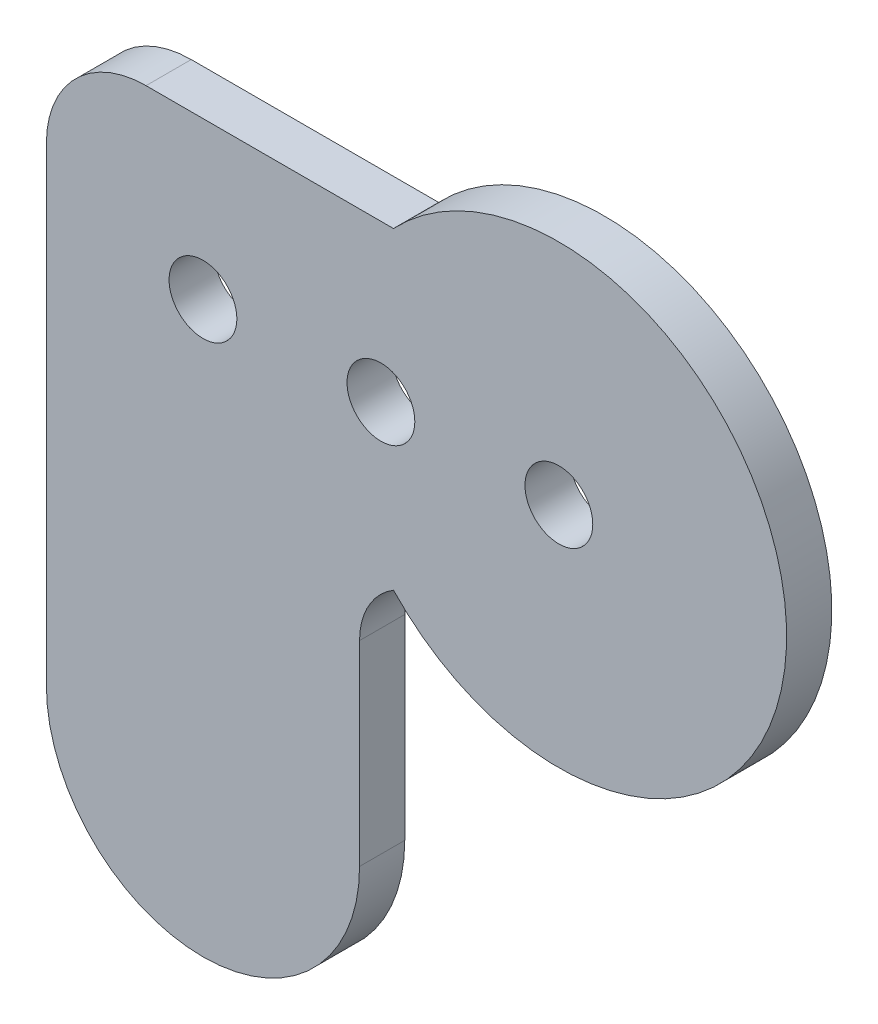
ISO-10303-21;
HEADER;
FILE_DESCRIPTION(('STEP AP214'),'2;1');
FILE_NAME('part.step','',(''),(''),'','','');
FILE_SCHEMA(('AUTOMOTIVE_DESIGN { 1 0 10303 214 1 1 1 1 }'));
ENDSEC;
DATA;
#1=APPLICATION_CONTEXT('core data for automotive mechanical design processes');
#2=APPLICATION_PROTOCOL_DEFINITION('international standard','automotive_design',2000,#1);
#3=PRODUCT_CONTEXT('',#1,'mechanical');
#4=PRODUCT('Part','Part','',(#3));
#5=PRODUCT_RELATED_PRODUCT_CATEGORY('part','',(#4));
#6=PRODUCT_DEFINITION_FORMATION('','',#4);
#7=PRODUCT_DEFINITION_CONTEXT('part definition',#1,'design');
#8=PRODUCT_DEFINITION('design','',#6,#7);
#9=PRODUCT_DEFINITION_SHAPE('','',#8);
#10=(LENGTH_UNIT() NAMED_UNIT(*) SI_UNIT(.MILLI.,.METRE.));
#11=(NAMED_UNIT(*) PLANE_ANGLE_UNIT() SI_UNIT($,.RADIAN.));
#12=(NAMED_UNIT(*) SI_UNIT($,.STERADIAN.) SOLID_ANGLE_UNIT());
#13=UNCERTAINTY_MEASURE_WITH_UNIT(LENGTH_MEASURE(1.E-05),#10,'distance_accuracy_value','');
#14=(GEOMETRIC_REPRESENTATION_CONTEXT(3) GLOBAL_UNCERTAINTY_ASSIGNED_CONTEXT((#13)) GLOBAL_UNIT_ASSIGNED_CONTEXT((#10,
#11,#12)) REPRESENTATION_CONTEXT('',''));
#15=CARTESIAN_POINT('',(0.,0.,0.));
#16=DIRECTION('',(0.,0.,1.));
#17=DIRECTION('',(1.,0.,0.));
#18=AXIS2_PLACEMENT_3D('',#15,#16,#17);
#19=CARTESIAN_POINT('',(0.,0.,3.175));
#20=DIRECTION('',(0.,0.,-1.));
#21=DIRECTION('',(-1.,0.,0.));
#22=AXIS2_PLACEMENT_3D('',#19,#20,#21);
#23=CYLINDRICAL_SURFACE('',#22,16.);
#24=CARTESIAN_POINT('',(0.,0.,0.));
#25=DIRECTION('',(0.,0.,1.));
#26=DIRECTION('',(1.,0.,0.));
#27=AXIS2_PLACEMENT_3D('',#24,#25,#26);
#28=CIRCLE('',#27,16.);
#29=CARTESIAN_POINT('',(-11.6189500386223,-11.,0.));
#30=VERTEX_POINT('',#29);
#31=CARTESIAN_POINT('',(-11.6189500386223,11.,0.));
#32=VERTEX_POINT('',#31);
#33=EDGE_CURVE('E115',#30,#32,#28,.T.);
#34=ORIENTED_EDGE('',*,*,#33,.T.);
#35=DIRECTION('',(0.,0.,-1.));
#36=VECTOR('',#35,1.);
#37=CARTESIAN_POINT('',(-11.6189500386223,11.,3.175));
#38=LINE('',#37,#36);
#39=CARTESIAN_POINT('',(-11.6189500386223,11.,3.175));
#40=VERTEX_POINT('',#39);
#41=EDGE_CURVE('E98',#40,#32,#38,.T.);
#42=ORIENTED_EDGE('',*,*,#41,.F.);
#43=CARTESIAN_POINT('',(0.,0.,3.175));
#44=DIRECTION('',(0.,0.,1.));
#45=DIRECTION('',(1.,0.,0.));
#46=AXIS2_PLACEMENT_3D('',#43,#44,#45);
#47=CIRCLE('',#46,16.);
#48=CARTESIAN_POINT('',(-11.6189500386223,-11.,3.175));
#49=VERTEX_POINT('',#48);
#50=EDGE_CURVE('E105',#49,#40,#47,.T.);
#51=ORIENTED_EDGE('',*,*,#50,.F.);
#52=DIRECTION('',(0.,0.,-1.));
#53=VECTOR('',#52,1.);
#54=CARTESIAN_POINT('',(-11.6189500386223,-11.,3.175));
#55=LINE('',#54,#53);
#56=EDGE_CURVE('E155',#49,#30,#55,.T.);
#57=ORIENTED_EDGE('',*,*,#56,.T.);
#58=EDGE_LOOP('',(#34,#42,#51,#57));
#59=FACE_BOUND('',#58,.T.);
#60=ADVANCED_FACE('F34',(#59),#23,.T.);
#61=CARTESIAN_POINT('',(-11.6189500386223,11.,3.175));
#62=DIRECTION('',(0.,-1.,0.));
#63=DIRECTION('',(1.,0.,0.));
#64=AXIS2_PLACEMENT_3D('',#61,#62,#63);
#65=PLANE('',#64);
#66=DIRECTION('',(-1.,0.,0.));
#67=VECTOR('',#66,1.);
#68=CARTESIAN_POINT('',(-11.6189500386223,11.,0.));
#69=LINE('',#68,#67);
#70=CARTESIAN_POINT('',(-29.,11.,0.));
#71=VERTEX_POINT('',#70);
#72=EDGE_CURVE('E143',#32,#71,#69,.T.);
#73=ORIENTED_EDGE('',*,*,#72,.T.);
#74=DIRECTION('',(0.,0.,-1.));
#75=VECTOR('',#74,1.);
#76=CARTESIAN_POINT('',(-29.,11.,3.175));
#77=LINE('',#76,#75);
#78=CARTESIAN_POINT('',(-29.,11.,3.175));
#79=VERTEX_POINT('',#78);
#80=EDGE_CURVE('E101',#71,#79,#77,.F.);
#81=ORIENTED_EDGE('',*,*,#80,.T.);
#82=DIRECTION('',(-1.,0.,0.));
#83=VECTOR('',#82,1.);
#84=CARTESIAN_POINT('',(-11.6189500386223,11.,3.175));
#85=LINE('',#84,#83);
#86=EDGE_CURVE('E93',#40,#79,#85,.T.);
#87=ORIENTED_EDGE('',*,*,#86,.F.);
#88=ORIENTED_EDGE('',*,*,#41,.T.);
#89=EDGE_LOOP('',(#73,#81,#87,#88));
#90=FACE_BOUND('',#89,.T.);
#91=ADVANCED_FACE('F96',(#90),#65,.F.);
#92=CARTESIAN_POINT('',(-36.,11.,3.175));
#93=DIRECTION('',(1.,0.,0.));
#94=DIRECTION('',(0.,1.,0.));
#95=AXIS2_PLACEMENT_3D('',#92,#93,#94);
#96=PLANE('',#95);
#97=DIRECTION('',(0.,-1.,0.));
#98=VECTOR('',#97,1.);
#99=CARTESIAN_POINT('',(-36.,11.,3.175));
#100=LINE('',#99,#98);
#101=CARTESIAN_POINT('',(-36.,3.99999999999999,3.175));
#102=VERTEX_POINT('',#101);
#103=CARTESIAN_POINT('',(-36.,-29.,3.175));
#104=VERTEX_POINT('',#103);
#105=EDGE_CURVE('E104',#102,#104,#100,.T.);
#106=ORIENTED_EDGE('',*,*,#105,.F.);
#107=DIRECTION('',(0.,0.,-1.));
#108=VECTOR('',#107,1.);
#109=CARTESIAN_POINT('',(-36.,3.99999999999999,3.175));
#110=LINE('',#109,#108);
#111=CARTESIAN_POINT('',(-36.,3.99999999999999,0.));
#112=VERTEX_POINT('',#111);
#113=EDGE_CURVE('E116',#102,#112,#110,.T.);
#114=ORIENTED_EDGE('',*,*,#113,.T.);
#115=DIRECTION('',(0.,-1.,0.));
#116=VECTOR('',#115,1.);
#117=CARTESIAN_POINT('',(-36.,11.,0.));
#118=LINE('',#117,#116);
#119=CARTESIAN_POINT('',(-36.,-29.,0.));
#120=VERTEX_POINT('',#119);
#121=EDGE_CURVE('E145',#112,#120,#118,.T.);
#122=ORIENTED_EDGE('',*,*,#121,.T.);
#123=DIRECTION('',(0.,0.,-1.));
#124=VECTOR('',#123,1.);
#125=CARTESIAN_POINT('',(-36.,-29.,3.175));
#126=LINE('',#125,#124);
#127=EDGE_CURVE('E117',#104,#120,#126,.T.);
#128=ORIENTED_EDGE('',*,*,#127,.F.);
#129=EDGE_LOOP('',(#106,#114,#122,#128));
#130=FACE_BOUND('',#129,.T.);
#131=ADVANCED_FACE('F136',(#130),#96,.F.);
#132=CARTESIAN_POINT('',(-25.,-29.,3.175));
#133=DIRECTION('',(0.,0.,-1.));
#134=DIRECTION('',(-1.,0.,0.));
#135=AXIS2_PLACEMENT_3D('',#132,#133,#134);
#136=CYLINDRICAL_SURFACE('',#135,11.);
#137=CARTESIAN_POINT('',(-25.,-29.,0.));
#138=DIRECTION('',(0.,0.,1.));
#139=DIRECTION('',(1.,0.,0.));
#140=AXIS2_PLACEMENT_3D('',#137,#138,#139);
#141=CIRCLE('',#140,11.);
#142=CARTESIAN_POINT('',(-14.,-29.,0.));
#143=VERTEX_POINT('',#142);
#144=EDGE_CURVE('E147',#120,#143,#141,.T.);
#145=ORIENTED_EDGE('',*,*,#144,.T.);
#146=DIRECTION('',(0.,0.,-1.));
#147=VECTOR('',#146,1.);
#148=CARTESIAN_POINT('',(-14.,-29.,3.175));
#149=LINE('',#148,#147);
#150=CARTESIAN_POINT('',(-14.,-29.,3.175));
#151=VERTEX_POINT('',#150);
#152=EDGE_CURVE('E123',#151,#143,#149,.T.);
#153=ORIENTED_EDGE('',*,*,#152,.F.);
#154=CARTESIAN_POINT('',(-25.,-29.,3.175));
#155=DIRECTION('',(0.,0.,1.));
#156=DIRECTION('',(1.,0.,0.));
#157=AXIS2_PLACEMENT_3D('',#154,#155,#156);
#158=CIRCLE('',#157,11.);
#159=EDGE_CURVE('E139',#104,#151,#158,.T.);
#160=ORIENTED_EDGE('',*,*,#159,.F.);
#161=ORIENTED_EDGE('',*,*,#127,.T.);
#162=EDGE_LOOP('',(#145,#153,#160,#161));
#163=FACE_BOUND('',#162,.T.);
#164=ADVANCED_FACE('F161',(#163),#136,.T.);
#165=CARTESIAN_POINT('',(-14.,-29.,3.175));
#166=DIRECTION('',(-1.,0.,0.));
#167=DIRECTION('',(0.,-1.,0.));
#168=AXIS2_PLACEMENT_3D('',#165,#166,#167);
#169=PLANE('',#168);
#170=DIRECTION('',(0.,1.,0.));
#171=VECTOR('',#170,1.);
#172=CARTESIAN_POINT('',(-14.,-29.,0.));
#173=LINE('',#172,#171);
#174=CARTESIAN_POINT('',(-14.,-15.2592371024868,0.));
#175=VERTEX_POINT('',#174);
#176=EDGE_CURVE('E113',#143,#175,#173,.T.);
#177=ORIENTED_EDGE('',*,*,#176,.T.);
#178=DIRECTION('',(0.,0.,-1.));
#179=VECTOR('',#178,1.);
#180=CARTESIAN_POINT('',(-14.,-15.2592371024868,3.175));
#181=LINE('',#180,#179);
#182=CARTESIAN_POINT('',(-14.,-15.2592371024868,3.175));
#183=VERTEX_POINT('',#182);
#184=EDGE_CURVE('E49',#175,#183,#181,.F.);
#185=ORIENTED_EDGE('',*,*,#184,.T.);
#186=DIRECTION('',(0.,1.,0.));
#187=VECTOR('',#186,1.);
#188=CARTESIAN_POINT('',(-14.,-29.,3.175));
#189=LINE('',#188,#187);
#190=EDGE_CURVE('E156',#151,#183,#189,.T.);
#191=ORIENTED_EDGE('',*,*,#190,.F.);
#192=ORIENTED_EDGE('',*,*,#152,.T.);
#193=EDGE_LOOP('',(#177,#185,#191,#192));
#194=FACE_BOUND('',#193,.T.);
#195=ADVANCED_FACE('F159',(#194),#169,.F.);
#196=CARTESIAN_POINT('',(0.,0.,3.175));
#197=DIRECTION('',(0.,0.,1.));
#198=DIRECTION('',(1.,0.,0.));
#199=AXIS2_PLACEMENT_3D('',#196,#197,#198);
#200=PLANE('',#199);
#201=CARTESIAN_POINT('',(-12.5,0.,3.175));
#202=DIRECTION('',(0.,0.,1.));
#203=DIRECTION('',(1.,0.,0.));
#204=AXIS2_PLACEMENT_3D('',#201,#202,#203);
#205=CIRCLE('',#204,2.38125);
#206=CARTESIAN_POINT('',(-10.11875,0.,3.175));
#207=VERTEX_POINT('',#206);
#208=EDGE_CURVE('E176',#207,#207,#205,.T.);
#209=ORIENTED_EDGE('',*,*,#208,.F.);
#210=EDGE_LOOP('',(#209));
#211=FACE_BOUND('',#210,.T.);
#212=CARTESIAN_POINT('',(-25.,0.,3.175));
#213=DIRECTION('',(0.,0.,1.));
#214=DIRECTION('',(1.,0.,0.));
#215=AXIS2_PLACEMENT_3D('',#212,#213,#214);
#216=CIRCLE('',#215,2.38125);
#217=CARTESIAN_POINT('',(-22.61875,0.,3.175));
#218=VERTEX_POINT('',#217);
#219=EDGE_CURVE('E170',#218,#218,#216,.T.);
#220=ORIENTED_EDGE('',*,*,#219,.F.);
#221=EDGE_LOOP('',(#220));
#222=FACE_BOUND('',#221,.T.);
#223=CARTESIAN_POINT('',(0.,0.,3.175));
#224=DIRECTION('',(0.,0.,1.));
#225=DIRECTION('',(1.,0.,0.));
#226=AXIS2_PLACEMENT_3D('',#223,#224,#225);
#227=CIRCLE('',#226,2.38125);
#228=CARTESIAN_POINT('',(2.38125,0.,3.175));
#229=VERTEX_POINT('',#228);
#230=EDGE_CURVE('E164',#229,#229,#227,.T.);
#231=ORIENTED_EDGE('',*,*,#230,.F.);
#232=EDGE_LOOP('',(#231));
#233=FACE_BOUND('',#232,.T.);
#234=ORIENTED_EDGE('',*,*,#86,.T.);
#235=CARTESIAN_POINT('',(-29.,3.99999999999999,3.175));
#236=DIRECTION('',(0.,0.,1.));
#237=DIRECTION('',(1.,0.,0.));
#238=AXIS2_PLACEMENT_3D('',#235,#236,#237);
#239=CIRCLE('',#238,7.);
#240=EDGE_CURVE('E129',#79,#102,#239,.T.);
#241=ORIENTED_EDGE('',*,*,#240,.T.);
#242=ORIENTED_EDGE('',*,*,#105,.T.);
#243=ORIENTED_EDGE('',*,*,#159,.T.);
#244=ORIENTED_EDGE('',*,*,#190,.T.);
#245=CARTESIAN_POINT('',(-9.00000000000001,-15.2592371024868,3.175));
#246=DIRECTION('',(0.,0.,1.));
#247=DIRECTION('',(1.,0.,0.));
#248=AXIS2_PLACEMENT_3D('',#245,#246,#247);
#249=CIRCLE('',#248,5.);
#250=EDGE_CURVE('E11',#183,#49,#249,.F.);
#251=ORIENTED_EDGE('',*,*,#250,.T.);
#252=ORIENTED_EDGE('',*,*,#50,.T.);
#253=EDGE_LOOP('',(#234,#241,#242,#243,#244,#251,#252));
#254=FACE_BOUND('',#253,.T.);
#255=ADVANCED_FACE('F108',(#211,#222,#233,#254),#200,.T.);
#256=CARTESIAN_POINT('',(0.,0.,0.));
#257=DIRECTION('',(0.,0.,1.));
#258=DIRECTION('',(1.,0.,0.));
#259=AXIS2_PLACEMENT_3D('',#256,#257,#258);
#260=PLANE('',#259);
#261=CARTESIAN_POINT('',(-12.5,0.,0.));
#262=DIRECTION('',(0.,0.,1.));
#263=DIRECTION('',(1.,0.,0.));
#264=AXIS2_PLACEMENT_3D('',#261,#262,#263);
#265=CIRCLE('',#264,2.38125);
#266=CARTESIAN_POINT('',(-10.11875,0.,0.));
#267=VERTEX_POINT('',#266);
#268=EDGE_CURVE('E167',#267,#267,#265,.T.);
#269=ORIENTED_EDGE('',*,*,#268,.T.);
#270=EDGE_LOOP('',(#269));
#271=FACE_BOUND('',#270,.T.);
#272=CARTESIAN_POINT('',(-25.,0.,0.));
#273=DIRECTION('',(0.,0.,1.));
#274=DIRECTION('',(1.,0.,0.));
#275=AXIS2_PLACEMENT_3D('',#272,#273,#274);
#276=CIRCLE('',#275,2.38125);
#277=CARTESIAN_POINT('',(-22.61875,0.,0.));
#278=VERTEX_POINT('',#277);
#279=EDGE_CURVE('E173',#278,#278,#276,.T.);
#280=ORIENTED_EDGE('',*,*,#279,.T.);
#281=EDGE_LOOP('',(#280));
#282=FACE_BOUND('',#281,.T.);
#283=CARTESIAN_POINT('',(0.,0.,0.));
#284=DIRECTION('',(0.,0.,1.));
#285=DIRECTION('',(1.,0.,0.));
#286=AXIS2_PLACEMENT_3D('',#283,#284,#285);
#287=CIRCLE('',#286,2.38125);
#288=CARTESIAN_POINT('',(2.38125,0.,0.));
#289=VERTEX_POINT('',#288);
#290=EDGE_CURVE('E149',#289,#289,#287,.T.);
#291=ORIENTED_EDGE('',*,*,#290,.T.);
#292=EDGE_LOOP('',(#291));
#293=FACE_BOUND('',#292,.T.);
#294=ORIENTED_EDGE('',*,*,#121,.F.);
#295=CARTESIAN_POINT('',(-29.,3.99999999999999,0.));
#296=DIRECTION('',(0.,0.,1.));
#297=DIRECTION('',(1.,0.,0.));
#298=AXIS2_PLACEMENT_3D('',#295,#296,#297);
#299=CIRCLE('',#298,7.);
#300=EDGE_CURVE('E120',#112,#71,#299,.F.);
#301=ORIENTED_EDGE('',*,*,#300,.T.);
#302=ORIENTED_EDGE('',*,*,#72,.F.);
#303=ORIENTED_EDGE('',*,*,#33,.F.);
#304=CARTESIAN_POINT('',(-9.00000000000001,-15.2592371024868,0.));
#305=DIRECTION('',(0.,0.,1.));
#306=DIRECTION('',(1.,0.,0.));
#307=AXIS2_PLACEMENT_3D('',#304,#305,#306);
#308=CIRCLE('',#307,5.);
#309=EDGE_CURVE('E42',#30,#175,#308,.T.);
#310=ORIENTED_EDGE('',*,*,#309,.T.);
#311=ORIENTED_EDGE('',*,*,#176,.F.);
#312=ORIENTED_EDGE('',*,*,#144,.F.);
#313=EDGE_LOOP('',(#294,#301,#302,#303,#310,#311,#312));
#314=FACE_BOUND('',#313,.T.);
#315=ADVANCED_FACE('F142',(#271,#282,#293,#314),#260,.F.);
#316=CARTESIAN_POINT('',(-29.,3.99999999999999,3.175));
#317=DIRECTION('',(0.,0.,-1.));
#318=DIRECTION('',(-1.,0.,0.));
#319=AXIS2_PLACEMENT_3D('',#316,#317,#318);
#320=CYLINDRICAL_SURFACE('',#319,7.);
#321=ORIENTED_EDGE('',*,*,#240,.F.);
#322=ORIENTED_EDGE('',*,*,#80,.F.);
#323=ORIENTED_EDGE('',*,*,#300,.F.);
#324=ORIENTED_EDGE('',*,*,#113,.F.);
#325=EDGE_LOOP('',(#321,#322,#323,#324));
#326=FACE_BOUND('',#325,.T.);
#327=ADVANCED_FACE('F141',(#326),#320,.T.);
#328=CARTESIAN_POINT('',(-9.00000000000001,-15.2592371024868,3.175));
#329=DIRECTION('',(0.,0.,-1.));
#330=DIRECTION('',(-1.,0.,0.));
#331=AXIS2_PLACEMENT_3D('',#328,#329,#330);
#332=CYLINDRICAL_SURFACE('',#331,5.);
#333=ORIENTED_EDGE('',*,*,#250,.F.);
#334=ORIENTED_EDGE('',*,*,#184,.F.);
#335=ORIENTED_EDGE('',*,*,#309,.F.);
#336=ORIENTED_EDGE('',*,*,#56,.F.);
#337=EDGE_LOOP('',(#333,#334,#335,#336));
#338=FACE_BOUND('',#337,.T.);
#339=ADVANCED_FACE('F36',(#338),#332,.F.);
#340=CARTESIAN_POINT('',(0.,0.,0.));
#341=DIRECTION('',(0.,0.,1.));
#342=DIRECTION('',(1.,0.,0.));
#343=AXIS2_PLACEMENT_3D('',#340,#341,#342);
#344=CYLINDRICAL_SURFACE('',#343,2.38125);
#345=ORIENTED_EDGE('',*,*,#290,.F.);
#346=EDGE_LOOP('',(#345));
#347=FACE_BOUND('',#346,.T.);
#348=ORIENTED_EDGE('',*,*,#230,.T.);
#349=EDGE_LOOP('',(#348));
#350=FACE_BOUND('',#349,.T.);
#351=ADVANCED_FACE('F198',(#347,#350),#344,.F.);
#352=CARTESIAN_POINT('',(-25.,0.,0.));
#353=DIRECTION('',(0.,0.,1.));
#354=DIRECTION('',(1.,0.,0.));
#355=AXIS2_PLACEMENT_3D('',#352,#353,#354);
#356=CYLINDRICAL_SURFACE('',#355,2.38125);
#357=ORIENTED_EDGE('',*,*,#279,.F.);
#358=EDGE_LOOP('',(#357));
#359=FACE_BOUND('',#358,.T.);
#360=ORIENTED_EDGE('',*,*,#219,.T.);
#361=EDGE_LOOP('',(#360));
#362=FACE_BOUND('',#361,.T.);
#363=ADVANCED_FACE('F187',(#359,#362),#356,.F.);
#364=CARTESIAN_POINT('',(-12.5,0.,0.));
#365=DIRECTION('',(0.,0.,1.));
#366=DIRECTION('',(1.,0.,0.));
#367=AXIS2_PLACEMENT_3D('',#364,#365,#366);
#368=CYLINDRICAL_SURFACE('',#367,2.38125);
#369=ORIENTED_EDGE('',*,*,#268,.F.);
#370=EDGE_LOOP('',(#369));
#371=FACE_BOUND('',#370,.T.);
#372=ORIENTED_EDGE('',*,*,#208,.T.);
#373=EDGE_LOOP('',(#372));
#374=FACE_BOUND('',#373,.T.);
#375=ADVANCED_FACE('F184',(#371,#374),#368,.F.);
#376=CLOSED_SHELL('',(#60,#91,#131,#164,#195,#255,#315,#327,#339,#351,#363,#375));
#377=MANIFOLD_SOLID_BREP('B2',#376);
#378=ADVANCED_BREP_SHAPE_REPRESENTATION('',(#18,#377),#14);
#379=SHAPE_DEFINITION_REPRESENTATION(#9,#378);
ENDSEC;
END-ISO-10303-21;
